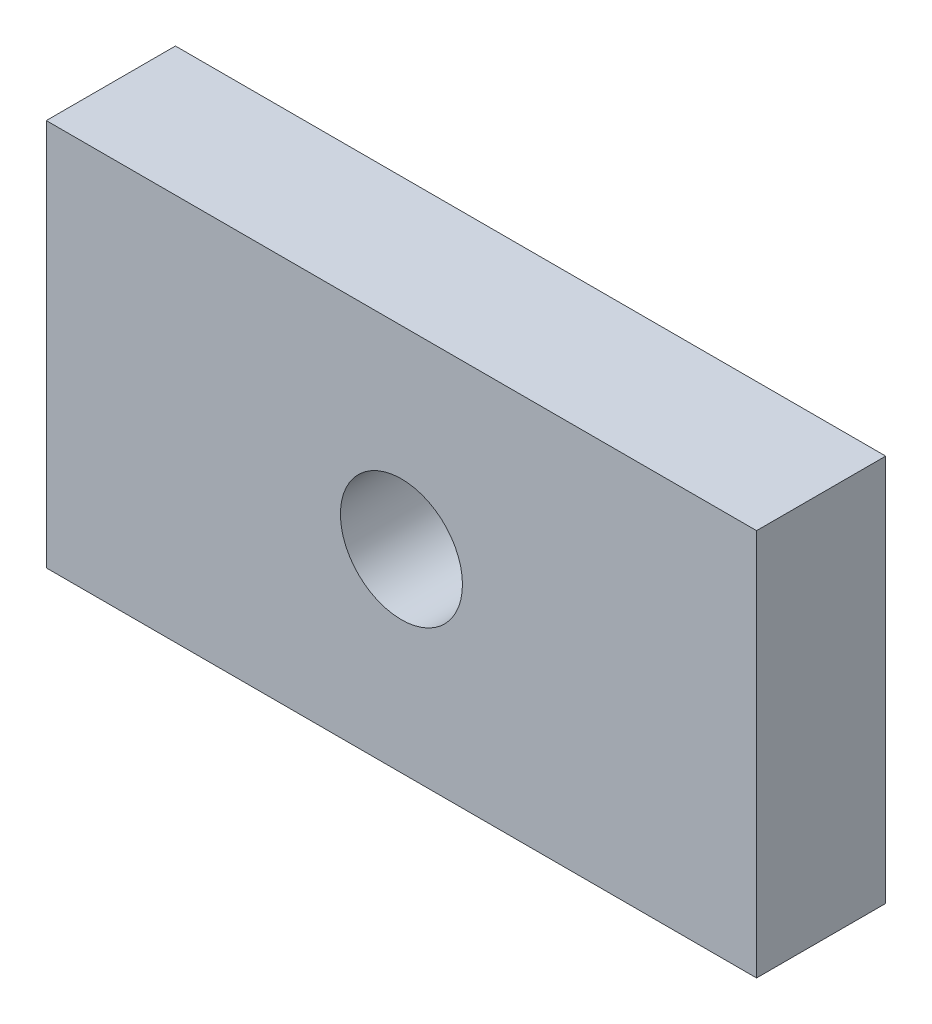
ISO-10303-21;
HEADER;
FILE_DESCRIPTION(('STEP AP214'),'2;1');
FILE_NAME('part.step','',(''),(''),'','','');
FILE_SCHEMA(('AUTOMOTIVE_DESIGN { 1 0 10303 214 1 1 1 1 }'));
ENDSEC;
DATA;
#1=APPLICATION_CONTEXT('core data for automotive mechanical design processes');
#2=APPLICATION_PROTOCOL_DEFINITION('international standard','automotive_design',2000,#1);
#3=PRODUCT_CONTEXT('',#1,'mechanical');
#4=PRODUCT('Part','Part','',(#3));
#5=PRODUCT_RELATED_PRODUCT_CATEGORY('part','',(#4));
#6=PRODUCT_DEFINITION_FORMATION('','',#4);
#7=PRODUCT_DEFINITION_CONTEXT('part definition',#1,'design');
#8=PRODUCT_DEFINITION('design','',#6,#7);
#9=PRODUCT_DEFINITION_SHAPE('','',#8);
#10=(LENGTH_UNIT() NAMED_UNIT(*) SI_UNIT(.MILLI.,.METRE.));
#11=(NAMED_UNIT(*) PLANE_ANGLE_UNIT() SI_UNIT($,.RADIAN.));
#12=(NAMED_UNIT(*) SI_UNIT($,.STERADIAN.) SOLID_ANGLE_UNIT());
#13=UNCERTAINTY_MEASURE_WITH_UNIT(LENGTH_MEASURE(1.E-05),#10,'distance_accuracy_value','');
#14=(GEOMETRIC_REPRESENTATION_CONTEXT(3) GLOBAL_UNCERTAINTY_ASSIGNED_CONTEXT((#13)) GLOBAL_UNIT_ASSIGNED_CONTEXT((#10,
#11,#12)) REPRESENTATION_CONTEXT('',''));
#15=CARTESIAN_POINT('',(0.,0.,0.));
#16=DIRECTION('',(0.,0.,1.));
#17=DIRECTION('',(1.,0.,0.));
#18=AXIS2_PLACEMENT_3D('',#15,#16,#17);
#19=CARTESIAN_POINT('',(0.,0.,20.));
#20=DIRECTION('',(0.,0.,-1.));
#21=DIRECTION('',(-1.,0.,0.));
#22=AXIS2_PLACEMENT_3D('',#19,#20,#21);
#23=PLANE('',#22);
#24=DIRECTION('',(0.,1.,0.));
#25=VECTOR('',#24,1.);
#26=CARTESIAN_POINT('',(55.,-30.,20.));
#27=LINE('',#26,#25);
#28=CARTESIAN_POINT('',(55.,-30.,20.));
#29=VERTEX_POINT('',#28);
#30=CARTESIAN_POINT('',(55.,30.,20.));
#31=VERTEX_POINT('',#30);
#32=EDGE_CURVE('E86',#29,#31,#27,.T.);
#33=ORIENTED_EDGE('',*,*,#32,.T.);
#34=DIRECTION('',(-1.,0.,0.));
#35=VECTOR('',#34,1.);
#36=CARTESIAN_POINT('',(-55.,30.,20.));
#37=LINE('',#36,#35);
#38=CARTESIAN_POINT('',(-55.,30.,20.));
#39=VERTEX_POINT('',#38);
#40=EDGE_CURVE('E81',#31,#39,#37,.T.);
#41=ORIENTED_EDGE('',*,*,#40,.T.);
#42=DIRECTION('',(0.,-1.,0.));
#43=VECTOR('',#42,1.);
#44=CARTESIAN_POINT('',(-55.,-30.,20.));
#45=LINE('',#44,#43);
#46=CARTESIAN_POINT('',(-55.,-30.,20.));
#47=VERTEX_POINT('',#46);
#48=EDGE_CURVE('E84',#39,#47,#45,.T.);
#49=ORIENTED_EDGE('',*,*,#48,.T.);
#50=DIRECTION('',(1.,0.,0.));
#51=VECTOR('',#50,1.);
#52=CARTESIAN_POINT('',(-55.,-30.,20.));
#53=LINE('',#52,#51);
#54=EDGE_CURVE('E51',#47,#29,#53,.T.);
#55=ORIENTED_EDGE('',*,*,#54,.T.);
#56=EDGE_LOOP('',(#33,#41,#49,#55));
#57=FACE_BOUND('',#56,.T.);
#58=CARTESIAN_POINT('',(0.,0.,20.));
#59=DIRECTION('',(0.,0.,1.));
#60=DIRECTION('',(1.,0.,0.));
#61=AXIS2_PLACEMENT_3D('',#58,#59,#60);
#62=CIRCLE('',#61,9.45056871484022);
#63=CARTESIAN_POINT('',(9.45056871484024,0.,20.));
#64=VERTEX_POINT('',#63);
#65=EDGE_CURVE('E102',#64,#64,#62,.T.);
#66=ORIENTED_EDGE('',*,*,#65,.F.);
#67=EDGE_LOOP('',(#66));
#68=FACE_BOUND('',#67,.T.);
#69=ADVANCED_FACE('F34',(#57,#68),#23,.F.);
#70=CARTESIAN_POINT('',(0.,0.,0.));
#71=DIRECTION('',(0.,0.,-1.));
#72=DIRECTION('',(-1.,0.,0.));
#73=AXIS2_PLACEMENT_3D('',#70,#71,#72);
#74=PLANE('',#73);
#75=DIRECTION('',(0.,1.,0.));
#76=VECTOR('',#75,1.);
#77=CARTESIAN_POINT('',(55.,-30.,0.));
#78=LINE('',#77,#76);
#79=CARTESIAN_POINT('',(55.,-30.,0.));
#80=VERTEX_POINT('',#79);
#81=CARTESIAN_POINT('',(55.,30.,0.));
#82=VERTEX_POINT('',#81);
#83=EDGE_CURVE('E99',#80,#82,#78,.T.);
#84=ORIENTED_EDGE('',*,*,#83,.F.);
#85=DIRECTION('',(1.,0.,0.));
#86=VECTOR('',#85,1.);
#87=CARTESIAN_POINT('',(-55.,-30.,0.));
#88=LINE('',#87,#86);
#89=CARTESIAN_POINT('',(-55.,-30.,0.));
#90=VERTEX_POINT('',#89);
#91=EDGE_CURVE('E74',#90,#80,#88,.T.);
#92=ORIENTED_EDGE('',*,*,#91,.F.);
#93=DIRECTION('',(0.,-1.,0.));
#94=VECTOR('',#93,1.);
#95=CARTESIAN_POINT('',(-55.,-30.,0.));
#96=LINE('',#95,#94);
#97=CARTESIAN_POINT('',(-55.,30.,0.));
#98=VERTEX_POINT('',#97);
#99=EDGE_CURVE('E68',#98,#90,#96,.T.);
#100=ORIENTED_EDGE('',*,*,#99,.F.);
#101=DIRECTION('',(-1.,0.,0.));
#102=VECTOR('',#101,1.);
#103=CARTESIAN_POINT('',(-55.,30.,0.));
#104=LINE('',#103,#102);
#105=EDGE_CURVE('E90',#82,#98,#104,.T.);
#106=ORIENTED_EDGE('',*,*,#105,.F.);
#107=EDGE_LOOP('',(#84,#92,#100,#106));
#108=FACE_BOUND('',#107,.T.);
#109=CARTESIAN_POINT('',(0.,0.,0.));
#110=DIRECTION('',(0.,0.,1.));
#111=DIRECTION('',(1.,0.,0.));
#112=AXIS2_PLACEMENT_3D('',#109,#110,#111);
#113=CIRCLE('',#112,9.45056871484022);
#114=CARTESIAN_POINT('',(9.45056871484024,0.,0.));
#115=VERTEX_POINT('',#114);
#116=EDGE_CURVE('E114',#115,#115,#113,.T.);
#117=ORIENTED_EDGE('',*,*,#116,.T.);
#118=EDGE_LOOP('',(#117));
#119=FACE_BOUND('',#118,.T.);
#120=ADVANCED_FACE('F110',(#108,#119),#74,.T.);
#121=CARTESIAN_POINT('',(55.,-30.,20.));
#122=DIRECTION('',(-1.,0.,0.));
#123=DIRECTION('',(0.,0.,1.));
#124=AXIS2_PLACEMENT_3D('',#121,#122,#123);
#125=PLANE('',#124);
#126=ORIENTED_EDGE('',*,*,#83,.T.);
#127=DIRECTION('',(0.,0.,-1.));
#128=VECTOR('',#127,1.);
#129=CARTESIAN_POINT('',(55.,30.,20.));
#130=LINE('',#129,#128);
#131=EDGE_CURVE('E11',#31,#82,#130,.T.);
#132=ORIENTED_EDGE('',*,*,#131,.F.);
#133=ORIENTED_EDGE('',*,*,#32,.F.);
#134=DIRECTION('',(0.,0.,-1.));
#135=VECTOR('',#134,1.);
#136=CARTESIAN_POINT('',(55.,-30.,20.));
#137=LINE('',#136,#135);
#138=EDGE_CURVE('E95',#29,#80,#137,.T.);
#139=ORIENTED_EDGE('',*,*,#138,.T.);
#140=EDGE_LOOP('',(#126,#132,#133,#139));
#141=FACE_BOUND('',#140,.T.);
#142=ADVANCED_FACE('F36',(#141),#125,.F.);
#143=CARTESIAN_POINT('',(-55.,30.,20.));
#144=DIRECTION('',(0.,-1.,0.));
#145=DIRECTION('',(0.,0.,-1.));
#146=AXIS2_PLACEMENT_3D('',#143,#144,#145);
#147=PLANE('',#146);
#148=ORIENTED_EDGE('',*,*,#105,.T.);
#149=DIRECTION('',(0.,0.,-1.));
#150=VECTOR('',#149,1.);
#151=CARTESIAN_POINT('',(-55.,30.,20.));
#152=LINE('',#151,#150);
#153=EDGE_CURVE('E43',#39,#98,#152,.T.);
#154=ORIENTED_EDGE('',*,*,#153,.F.);
#155=ORIENTED_EDGE('',*,*,#40,.F.);
#156=ORIENTED_EDGE('',*,*,#131,.T.);
#157=EDGE_LOOP('',(#148,#154,#155,#156));
#158=FACE_BOUND('',#157,.T.);
#159=ADVANCED_FACE('F89',(#158),#147,.F.);
#160=CARTESIAN_POINT('',(-55.,-30.,20.));
#161=DIRECTION('',(1.,0.,0.));
#162=DIRECTION('',(0.,0.,-1.));
#163=AXIS2_PLACEMENT_3D('',#160,#161,#162);
#164=PLANE('',#163);
#165=ORIENTED_EDGE('',*,*,#99,.T.);
#166=DIRECTION('',(0.,0.,-1.));
#167=VECTOR('',#166,1.);
#168=CARTESIAN_POINT('',(-55.,-30.,20.));
#169=LINE('',#168,#167);
#170=EDGE_CURVE('E91',#47,#90,#169,.T.);
#171=ORIENTED_EDGE('',*,*,#170,.F.);
#172=ORIENTED_EDGE('',*,*,#48,.F.);
#173=ORIENTED_EDGE('',*,*,#153,.T.);
#174=EDGE_LOOP('',(#165,#171,#172,#173));
#175=FACE_BOUND('',#174,.T.);
#176=ADVANCED_FACE('F92',(#175),#164,.F.);
#177=CARTESIAN_POINT('',(-55.,-30.,20.));
#178=DIRECTION('',(0.,1.,0.));
#179=DIRECTION('',(0.,0.,1.));
#180=AXIS2_PLACEMENT_3D('',#177,#178,#179);
#181=PLANE('',#180);
#182=ORIENTED_EDGE('',*,*,#91,.T.);
#183=ORIENTED_EDGE('',*,*,#138,.F.);
#184=ORIENTED_EDGE('',*,*,#54,.F.);
#185=ORIENTED_EDGE('',*,*,#170,.T.);
#186=EDGE_LOOP('',(#182,#183,#184,#185));
#187=FACE_BOUND('',#186,.T.);
#188=ADVANCED_FACE('F107',(#187),#181,.F.);
#189=CARTESIAN_POINT('',(0.,0.,20.));
#190=DIRECTION('',(0.,0.,-1.));
#191=DIRECTION('',(-1.,0.,0.));
#192=AXIS2_PLACEMENT_3D('',#189,#190,#191);
#193=CYLINDRICAL_SURFACE('',#192,9.45056871484022);
#194=ORIENTED_EDGE('',*,*,#65,.T.);
#195=EDGE_LOOP('',(#194));
#196=FACE_BOUND('',#195,.T.);
#197=ORIENTED_EDGE('',*,*,#116,.F.);
#198=EDGE_LOOP('',(#197));
#199=FACE_BOUND('',#198,.T.);
#200=ADVANCED_FACE('F120',(#196,#199),#193,.F.);
#201=CLOSED_SHELL('',(#69,#120,#142,#159,#176,#188,#200));
#202=MANIFOLD_SOLID_BREP('B2',#201);
#203=ADVANCED_BREP_SHAPE_REPRESENTATION('',(#18,#202),#14);
#204=SHAPE_DEFINITION_REPRESENTATION(#9,#203);
ENDSEC;
END-ISO-10303-21;
